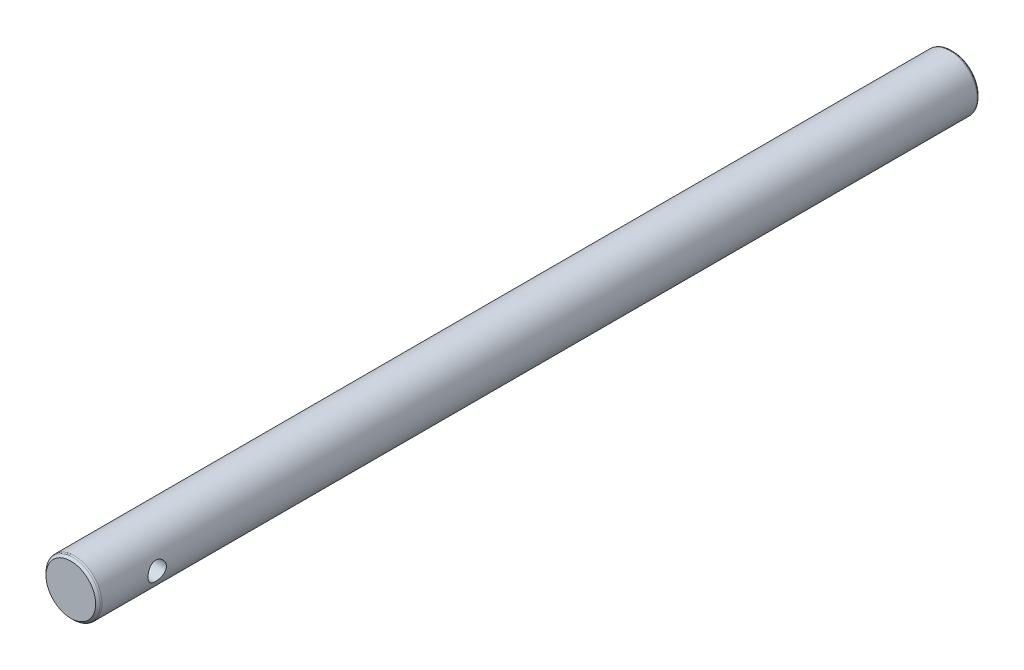
ISO-10303-21;
HEADER;
FILE_DESCRIPTION(('STEP AP214'),'2;1');
FILE_NAME('part.step','',(''),(''),'','','');
FILE_SCHEMA(('AUTOMOTIVE_DESIGN { 1 0 10303 214 1 1 1 1 }'));
ENDSEC;
DATA;
#1=APPLICATION_CONTEXT('core data for automotive mechanical design processes');
#2=APPLICATION_PROTOCOL_DEFINITION('international standard','automotive_design',2000,#1);
#3=PRODUCT_CONTEXT('',#1,'mechanical');
#4=PRODUCT('Part','Part','',(#3));
#5=PRODUCT_RELATED_PRODUCT_CATEGORY('part','',(#4));
#6=PRODUCT_DEFINITION_FORMATION('','',#4);
#7=PRODUCT_DEFINITION_CONTEXT('part definition',#1,'design');
#8=PRODUCT_DEFINITION('design','',#6,#7);
#9=PRODUCT_DEFINITION_SHAPE('','',#8);
#10=(LENGTH_UNIT() NAMED_UNIT(*) SI_UNIT(.MILLI.,.METRE.));
#11=(NAMED_UNIT(*) PLANE_ANGLE_UNIT() SI_UNIT($,.RADIAN.));
#12=(NAMED_UNIT(*) SI_UNIT($,.STERADIAN.) SOLID_ANGLE_UNIT());
#13=UNCERTAINTY_MEASURE_WITH_UNIT(LENGTH_MEASURE(1.E-05),#10,'distance_accuracy_value','');
#14=(GEOMETRIC_REPRESENTATION_CONTEXT(3) GLOBAL_UNCERTAINTY_ASSIGNED_CONTEXT((#13)) GLOBAL_UNIT_ASSIGNED_CONTEXT((#10,
#11,#12)) REPRESENTATION_CONTEXT('',''));
#15=CARTESIAN_POINT('',(0.,0.,0.));
#16=DIRECTION('',(0.,0.,1.));
#17=DIRECTION('',(1.,0.,0.));
#18=AXIS2_PLACEMENT_3D('',#15,#16,#17);
#19=CARTESIAN_POINT('',(0.,0.,76.2));
#20=DIRECTION('',(0.,0.,-1.));
#21=DIRECTION('',(-1.,0.,0.));
#22=AXIS2_PLACEMENT_3D('',#19,#20,#21);
#23=CYLINDRICAL_SURFACE('',#22,4.7625);
#24=CARTESIAN_POINT('',(4.7625,0.,67.6275));
#25=CARTESIAN_POINT('',(4.76250024290249,0.0866193385826752,67.627500402799));
#26=CARTESIAN_POINT('',(4.76011509093227,0.173236246329952,67.6203875775231));
#27=CARTESIAN_POINT('',(4.75083521197708,0.343918795385851,67.5922112897527));
#28=CARTESIAN_POINT('',(4.74394001683417,0.427984170888632,67.5711463789811));
#29=CARTESIAN_POINT('',(4.72638926301477,0.591078303334081,67.5158682011279));
#30=CARTESIAN_POINT('',(4.71573999272729,0.670115223594092,67.4816769133459));
#31=CARTESIAN_POINT('',(4.6917680757628,0.821332712178469,67.4012158881192));
#32=CARTESIAN_POINT('',(4.67844490185097,0.893511924171965,67.3549437680584));
#33=CARTESIAN_POINT('',(4.6500112492827,1.03146490909787,67.2499515347867));
#34=CARTESIAN_POINT('',(4.63485795886258,1.09696837422359,67.1908879156115));
#35=CARTESIAN_POINT('',(4.60470749718205,1.21734689966459,67.0627196419033));
#36=CARTESIAN_POINT('',(4.58971036098746,1.27221961946455,66.993612782051));
#37=CARTESIAN_POINT('',(4.56109915307671,1.37132209578676,66.8448861296256));
#38=CARTESIAN_POINT('',(4.54753724850154,1.41520046242592,66.7650211881753));
#39=CARTESIAN_POINT('',(4.52398297352028,1.48878746228092,66.5985204500471));
#40=CARTESIAN_POINT('',(4.51398951405182,1.51850041960152,66.5118867290042));
#41=CARTESIAN_POINT('',(4.49915443940135,1.56189912014583,66.337381260874));
#42=CARTESIAN_POINT('',(4.49415052034256,1.57609134913147,66.2496496815236));
#43=CARTESIAN_POINT('',(4.48938104899342,1.58962903329352,66.0729187902775));
#44=CARTESIAN_POINT('',(4.48961387798582,1.58897907629753,65.9839198786241));
#45=CARTESIAN_POINT('',(4.49514936325485,1.57324409712922,65.8115005991701));
#46=CARTESIAN_POINT('',(4.50021985189707,1.55882008715264,65.728011160366));
#47=CARTESIAN_POINT('',(4.51447944137723,1.51702478352349,65.5647129463741));
#48=CARTESIAN_POINT('',(4.52366903532269,1.48965193971464,65.4849046131218));
#49=CARTESIAN_POINT('',(4.54529683920856,1.42230325467062,65.3297322600235));
#50=CARTESIAN_POINT('',(4.55778498196572,1.38213155232282,65.2544605095671));
#51=CARTESIAN_POINT('',(4.58458186738965,1.29046145625627,65.1115174331059));
#52=CARTESIAN_POINT('',(4.5988911354236,1.2389597908779,65.0438483109932));
#53=CARTESIAN_POINT('',(4.62863135053788,1.12291706563309,64.9143170879198));
#54=CARTESIAN_POINT('',(4.64408185600812,1.05783562574618,64.8529425974668));
#55=CARTESIAN_POINT('',(4.6737101468942,0.918114067327511,64.7418516141718));
#56=CARTESIAN_POINT('',(4.68788781016681,0.843473033111574,64.6921362394138));
#57=CARTESIAN_POINT('',(4.71355908851247,0.685716835710973,64.6053821233768));
#58=CARTESIAN_POINT('',(4.72502468137762,0.602524951310954,64.5684740324966));
#59=CARTESIAN_POINT('',(4.7437765034179,0.43063966984117,64.5093274613453));
#60=CARTESIAN_POINT('',(4.75106418427121,0.341948195571001,64.4870838852652));
#61=CARTESIAN_POINT('',(4.76039857975912,0.165709329377779,64.4587616301894));
#62=CARTESIAN_POINT('',(4.76265877911043,0.0782789897854502,64.4520240529382));
#63=CARTESIAN_POINT('',(4.76232383028038,-0.0964804235618728,64.4530281193375));
#64=CARTESIAN_POINT('',(4.75972950165738,-0.183809511919942,64.460767318968));
#65=CARTESIAN_POINT('',(4.75011789238403,-0.353250287758005,64.4899839035308));
#66=CARTESIAN_POINT('',(4.74323090454018,-0.435439830850314,64.5110568521035));
#67=CARTESIAN_POINT('',(4.72585806842736,-0.595083834245077,64.5658370930909));
#68=CARTESIAN_POINT('',(4.71537176124096,-0.67253768925742,64.5995459966551));
#69=CARTESIAN_POINT('',(4.69152178418572,-0.822782670524332,64.6796243105472));
#70=CARTESIAN_POINT('',(4.6780896842481,-0.895397560257234,64.726303416837));
#71=CARTESIAN_POINT('',(4.64987090592066,-1.03197791784026,64.8306332131463));
#72=CARTESIAN_POINT('',(4.63508381455201,-1.09594073387549,64.8882872539504));
#73=CARTESIAN_POINT('',(4.60496996168956,-1.21642585614252,65.0160287672229));
#74=CARTESIAN_POINT('',(4.58964920726291,-1.27247803867768,65.0865621477463));
#75=CARTESIAN_POINT('',(4.56088707605349,-1.3720088166887,65.2363623638997));
#76=CARTESIAN_POINT('',(4.54744571493928,-1.41548730734051,65.3156292723316));
#77=CARTESIAN_POINT('',(4.5240954696882,-1.48843512703601,65.4806809117727));
#78=CARTESIAN_POINT('',(4.51417945258853,-1.517932784812,65.5664520506804));
#79=CARTESIAN_POINT('',(4.49914696286487,-1.56193278348051,65.742151106945));
#80=CARTESIAN_POINT('',(4.49402832815026,-1.57644187973942,65.8320771325794));
#81=CARTESIAN_POINT('',(4.48941600962755,-1.58952609843282,66.0085628899649));
#82=CARTESIAN_POINT('',(4.48964685408645,-1.58888153347712,66.0950582152053));
#83=CARTESIAN_POINT('',(4.49502640845388,-1.57359714084984,66.2666395564388));
#84=CARTESIAN_POINT('',(4.5001748256636,-1.55895814614054,66.3517256560037));
#85=CARTESIAN_POINT('',(4.51460432334014,-1.51665275334288,66.5164653650164));
#86=CARTESIAN_POINT('',(4.52380505610682,-1.48923906179967,66.5961914596946));
#87=CARTESIAN_POINT('',(4.54527283124317,-1.42236724314364,66.7499735085145));
#88=CARTESIAN_POINT('',(4.55754055411885,-1.38290644257921,66.8240281995109));
#89=CARTESIAN_POINT('',(4.58442741396347,-1.29105134947624,66.9678678260026));
#90=CARTESIAN_POINT('',(4.59912579731891,-1.23816783538881,67.0373254467637));
#91=CARTESIAN_POINT('',(4.62888578099663,-1.12179557697788,67.1666325787474));
#92=CARTESIAN_POINT('',(4.6439474829839,-1.05830383406677,67.2264793639048));
#93=CARTESIAN_POINT('',(4.67344173459301,-0.919545971611627,67.3372167545091));
#94=CARTESIAN_POINT('',(4.68782688609494,-0.843917402680852,67.3876674020547));
#95=CARTESIAN_POINT('',(4.71370010986521,-0.684779804883044,67.4750848058004));
#96=CARTESIAN_POINT('',(4.72518892253838,-0.601272797535128,67.5120550091513));
#97=CARTESIAN_POINT('',(4.7435375517131,-0.432583664931567,67.5699080915758));
#98=CARTESIAN_POINT('',(4.75058124720755,-0.347643065311313,67.5914359151931));
#99=CARTESIAN_POINT('',(4.76006171214452,-0.175133660416274,67.620229695575));
#100=CARTESIAN_POINT('',(4.76249975444399,-0.0875655880903884,67.6274995928008));
#101=CARTESIAN_POINT('',(4.7625,0.,67.6275));
#102=B_SPLINE_CURVE_WITH_KNOTS('',3,(#24,#25,#26,#27,#28,#29,#30,#31,#32,#33,#34,#35,#36,#37,
#38,#39,#40,#41,#42,#43,#44,#45,#46,#47,#48,#49,#50,#51,#52,#53,#54,#55,#56,#57,#58,#59,#60,#61,
#62,#63,#64,#65,#66,#67,#68,#69,#70,#71,#72,#73,#74,#75,#76,#77,#78,#79,#80,#81,#82,#83,#84,#85,
#86,#87,#88,#89,#90,#91,#92,#93,#94,#95,#96,#97,#98,#99,#100,#101),.UNSPECIFIED.,.T.,.F.,(4,2,2,
2,2,2,2,2,2,2,2,2,2,2,2,2,2,2,2,2,2,2,2,2,2,2,2,2,2,2,2,2,2,2,2,2,2,2,4),(0.,0.259535780816299,
0.519098506612198,0.77822849318157,1.03740962475609,1.30468186298879,1.57201287843958,
1.84703060907263,2.12196433449878,2.38763057115177,2.65321468955139,2.90666212150164,
3.16013990233084,3.41769971708777,3.67533400311161,3.94641872975553,4.21752944222016,
4.49132968969953,4.7650347434258,5.02687563290594,5.28867232148143,5.54288575790426,
5.79713161888529,6.05806509751946,6.31907837054766,6.59195123823207,6.86482638073074,
7.13714621950015,7.40934326970539,7.66755619877028,7.92575375970327,8.1790474449018,
8.43239738104383,8.6968023087326,8.9612821015902,9.23606961575744,9.51078681329547,
9.77323036418453,10.0356013733557),.UNSPECIFIED.);
#103=CARTESIAN_POINT('',(4.7625,0.,67.6275));
#104=VERTEX_POINT('',#103);
#105=EDGE_CURVE('E10',#104,#104,#102,.T.);
#106=ORIENTED_EDGE('',*,*,#105,.T.);
#107=EDGE_LOOP('',(#106));
#108=FACE_BOUND('',#107,.T.);
#109=CARTESIAN_POINT('',(-4.7625,0.,67.6275));
#110=CARTESIAN_POINT('',(-4.76250024290249,-0.0866193385826751,67.627500402799));
#111=CARTESIAN_POINT('',(-4.76011509093227,-0.173236246329952,67.6203875775231));
#112=CARTESIAN_POINT('',(-4.75083521197708,-0.343918795385851,67.5922112897527));
#113=CARTESIAN_POINT('',(-4.74394001683417,-0.427984170888632,67.5711463789811));
#114=CARTESIAN_POINT('',(-4.72638926301477,-0.591078303334081,67.5158682011279));
#115=CARTESIAN_POINT('',(-4.71573999272729,-0.670115223594092,67.4816769133459));
#116=CARTESIAN_POINT('',(-4.6917680757628,-0.821332712178469,67.4012158881192));
#117=CARTESIAN_POINT('',(-4.67844490185097,-0.893511924171965,67.3549437680584));
#118=CARTESIAN_POINT('',(-4.6500112492827,-1.03146490909787,67.2499515347867));
#119=CARTESIAN_POINT('',(-4.63485795886258,-1.09696837422359,67.1908879156115));
#120=CARTESIAN_POINT('',(-4.60470749718205,-1.21734689966459,67.0627196419033));
#121=CARTESIAN_POINT('',(-4.58971036098746,-1.27221961946455,66.993612782051));
#122=CARTESIAN_POINT('',(-4.56109915307671,-1.37132209578676,66.8448861296256));
#123=CARTESIAN_POINT('',(-4.54753724850154,-1.41520046242592,66.7650211881753));
#124=CARTESIAN_POINT('',(-4.52398297352028,-1.48878746228092,66.5985204500471));
#125=CARTESIAN_POINT('',(-4.51398951405182,-1.51850041960152,66.5118867290042));
#126=CARTESIAN_POINT('',(-4.49915443940135,-1.56189912014583,66.337381260874));
#127=CARTESIAN_POINT('',(-4.49415052034256,-1.57609134913147,66.2496496815236));
#128=CARTESIAN_POINT('',(-4.48938104899342,-1.58962903329352,66.0729187902775));
#129=CARTESIAN_POINT('',(-4.48961387798582,-1.58897907629753,65.9839198786241));
#130=CARTESIAN_POINT('',(-4.49514936325485,-1.57324409712922,65.8115005991701));
#131=CARTESIAN_POINT('',(-4.50021985189707,-1.55882008715264,65.728011160366));
#132=CARTESIAN_POINT('',(-4.51447944137723,-1.51702478352349,65.5647129463741));
#133=CARTESIAN_POINT('',(-4.52366903532269,-1.48965193971464,65.4849046131218));
#134=CARTESIAN_POINT('',(-4.54529683920856,-1.42230325467062,65.3297322600235));
#135=CARTESIAN_POINT('',(-4.55778498196572,-1.38213155232282,65.2544605095671));
#136=CARTESIAN_POINT('',(-4.58458186738965,-1.29046145625627,65.1115174331059));
#137=CARTESIAN_POINT('',(-4.5988911354236,-1.2389597908779,65.0438483109932));
#138=CARTESIAN_POINT('',(-4.62863135053788,-1.12291706563309,64.9143170879198));
#139=CARTESIAN_POINT('',(-4.64408185600812,-1.05783562574618,64.8529425974668));
#140=CARTESIAN_POINT('',(-4.6737101468942,-0.918114067327511,64.7418516141718));
#141=CARTESIAN_POINT('',(-4.68788781016681,-0.843473033111574,64.6921362394138));
#142=CARTESIAN_POINT('',(-4.71355908851247,-0.685716835710973,64.6053821233768));
#143=CARTESIAN_POINT('',(-4.72502468137762,-0.602524951310954,64.5684740324966));
#144=CARTESIAN_POINT('',(-4.7437765034179,-0.43063966984117,64.5093274613453));
#145=CARTESIAN_POINT('',(-4.75106418427121,-0.341948195571001,64.4870838852652));
#146=CARTESIAN_POINT('',(-4.76039857975912,-0.165709329377779,64.4587616301894));
#147=CARTESIAN_POINT('',(-4.76265877911043,-0.0782789897854506,64.4520240529382));
#148=CARTESIAN_POINT('',(-4.76232383028038,0.0964804235618722,64.4530281193375));
#149=CARTESIAN_POINT('',(-4.75972950165738,0.183809511919941,64.460767318968));
#150=CARTESIAN_POINT('',(-4.75011789238403,0.353250287758004,64.4899839035308));
#151=CARTESIAN_POINT('',(-4.74323090454018,0.435439830850314,64.5110568521035));
#152=CARTESIAN_POINT('',(-4.72585806842736,0.595083834245076,64.5658370930909));
#153=CARTESIAN_POINT('',(-4.71537176124096,0.672537689257419,64.5995459966551));
#154=CARTESIAN_POINT('',(-4.69152178418572,0.822782670524332,64.6796243105472));
#155=CARTESIAN_POINT('',(-4.6780896842481,0.895397560257234,64.726303416837));
#156=CARTESIAN_POINT('',(-4.64987090592066,1.03197791784026,64.8306332131463));
#157=CARTESIAN_POINT('',(-4.63508381455201,1.09594073387549,64.8882872539504));
#158=CARTESIAN_POINT('',(-4.60496996168956,1.21642585614252,65.0160287672229));
#159=CARTESIAN_POINT('',(-4.58964920726291,1.27247803867768,65.0865621477463));
#160=CARTESIAN_POINT('',(-4.56088707605349,1.3720088166887,65.2363623638997));
#161=CARTESIAN_POINT('',(-4.54744571493928,1.41548730734051,65.3156292723316));
#162=CARTESIAN_POINT('',(-4.5240954696882,1.48843512703601,65.4806809117727));
#163=CARTESIAN_POINT('',(-4.51417945258853,1.517932784812,65.5664520506804));
#164=CARTESIAN_POINT('',(-4.49914696286487,1.56193278348051,65.742151106945));
#165=CARTESIAN_POINT('',(-4.49402832815026,1.57644187973942,65.8320771325794));
#166=CARTESIAN_POINT('',(-4.48941600962755,1.58952609843282,66.0085628899649));
#167=CARTESIAN_POINT('',(-4.48964685408645,1.58888153347712,66.0950582152053));
#168=CARTESIAN_POINT('',(-4.49502640845388,1.57359714084984,66.2666395564388));
#169=CARTESIAN_POINT('',(-4.5001748256636,1.55895814614054,66.3517256560037));
#170=CARTESIAN_POINT('',(-4.51460432334014,1.51665275334288,66.5164653650164));
#171=CARTESIAN_POINT('',(-4.52380505610682,1.48923906179967,66.5961914596946));
#172=CARTESIAN_POINT('',(-4.54527283124317,1.42236724314364,66.7499735085145));
#173=CARTESIAN_POINT('',(-4.55754055411885,1.38290644257921,66.8240281995109));
#174=CARTESIAN_POINT('',(-4.58442741396347,1.29105134947624,66.9678678260026));
#175=CARTESIAN_POINT('',(-4.59912579731891,1.23816783538881,67.0373254467637));
#176=CARTESIAN_POINT('',(-4.62888578099663,1.12179557697788,67.1666325787474));
#177=CARTESIAN_POINT('',(-4.6439474829839,1.05830383406677,67.2264793639048));
#178=CARTESIAN_POINT('',(-4.67344173459301,0.919545971611627,67.3372167545091));
#179=CARTESIAN_POINT('',(-4.68782688609494,0.843917402680852,67.3876674020547));
#180=CARTESIAN_POINT('',(-4.71370010986521,0.684779804883044,67.4750848058004));
#181=CARTESIAN_POINT('',(-4.72518892253838,0.601272797535128,67.5120550091513));
#182=CARTESIAN_POINT('',(-4.7435375517131,0.432583664931567,67.5699080915758));
#183=CARTESIAN_POINT('',(-4.75058124720755,0.347643065311313,67.5914359151931));
#184=CARTESIAN_POINT('',(-4.76006171214452,0.175133660416274,67.620229695575));
#185=CARTESIAN_POINT('',(-4.76249975444399,0.0875655880903884,67.6274995928008));
#186=CARTESIAN_POINT('',(-4.7625,0.,67.6275));
#187=B_SPLINE_CURVE_WITH_KNOTS('',3,(#109,#110,#111,#112,#113,#114,#115,#116,#117,#118,#119,
#120,#121,#122,#123,#124,#125,#126,#127,#128,#129,#130,#131,#132,#133,#134,#135,#136,#137,#138,
#139,#140,#141,#142,#143,#144,#145,#146,#147,#148,#149,#150,#151,#152,#153,#154,#155,#156,#157,
#158,#159,#160,#161,#162,#163,#164,#165,#166,#167,#168,#169,#170,#171,#172,#173,#174,#175,#176,
#177,#178,#179,#180,#181,#182,#183,#184,#185,#186),.UNSPECIFIED.,.T.,.F.,(4,2,2,2,2,2,2,2,2,2,2,
2,2,2,2,2,2,2,2,2,2,2,2,2,2,2,2,2,2,2,2,2,2,2,2,2,2,2,4),(0.,0.259535780816298,
0.519098506612198,0.778228493181571,1.03740962475609,1.30468186298879,1.57201287843958,
1.84703060907263,2.12196433449878,2.38763057115177,2.65321468955139,2.90666212150164,
3.16013990233084,3.41769971708777,3.67533400311161,3.94641872975553,4.21752944222016,
4.49132968969953,4.7650347434258,5.02687563290594,5.28867232148142,5.54288575790426,
5.79713161888528,6.05806509751945,6.31907837054766,6.59195123823207,6.86482638073074,
7.13714621950015,7.40934326970539,7.66755619877028,7.92575375970327,8.1790474449018,
8.43239738104383,8.69680230873259,8.9612821015902,9.23606961575743,9.51078681329547,
9.77323036418453,10.0356013733557),.UNSPECIFIED.);
#188=CARTESIAN_POINT('',(-4.7625,0.,67.6275));
#189=VERTEX_POINT('',#188);
#190=EDGE_CURVE('E43',#189,#189,#187,.T.);
#191=ORIENTED_EDGE('',*,*,#190,.T.);
#192=EDGE_LOOP('',(#191));
#193=FACE_BOUND('',#192,.T.);
#194=CARTESIAN_POINT('',(0.,0.,75.5757980931899));
#195=DIRECTION('',(0.,0.,1.));
#196=DIRECTION('',(1.,0.,0.));
#197=AXIS2_PLACEMENT_3D('',#194,#195,#196);
#198=CIRCLE('',#197,4.7625);
#199=CARTESIAN_POINT('',(4.7625,0.,75.5757980931899));
#200=VERTEX_POINT('',#199);
#201=EDGE_CURVE('E86',#200,#200,#198,.F.);
#202=ORIENTED_EDGE('',*,*,#201,.T.);
#203=EDGE_LOOP('',(#202));
#204=FACE_BOUND('',#203,.T.);
#205=CARTESIAN_POINT('',(0.,0.,-75.5757980931897));
#206=DIRECTION('',(0.,0.,-1.));
#207=DIRECTION('',(-1.,0.,0.));
#208=AXIS2_PLACEMENT_3D('',#205,#206,#207);
#209=CIRCLE('',#208,4.7625);
#210=CARTESIAN_POINT('',(-4.7625,0.,-75.5757980931897));
#211=VERTEX_POINT('',#210);
#212=EDGE_CURVE('E89',#211,#211,#209,.F.);
#213=ORIENTED_EDGE('',*,*,#212,.T.);
#214=EDGE_LOOP('',(#213));
#215=FACE_BOUND('',#214,.T.);
#216=ADVANCED_FACE('F31',(#108,#193,#204,#215),#23,.T.);
#217=CARTESIAN_POINT('',(0.,0.,76.2));
#218=DIRECTION('',(0.,0.,1.));
#219=DIRECTION('',(1.,0.,0.));
#220=AXIS2_PLACEMENT_3D('',#217,#218,#219);
#221=PLANE('',#220);
#222=CARTESIAN_POINT('',(0.,0.,76.2));
#223=DIRECTION('',(0.,0.,1.));
#224=DIRECTION('',(1.,0.,0.));
#225=AXIS2_PLACEMENT_3D('',#222,#223,#224);
#226=CIRCLE('',#225,4.28625000000007);
#227=CARTESIAN_POINT('',(-4.28625000000008,0.,76.2));
#228=VERTEX_POINT('',#227);
#229=EDGE_CURVE('E94',#228,#228,#226,.T.);
#230=ORIENTED_EDGE('',*,*,#229,.T.);
#231=EDGE_LOOP('',(#230));
#232=FACE_BOUND('',#231,.T.);
#233=ADVANCED_FACE('F65',(#232),#221,.T.);
#234=CARTESIAN_POINT('',(0.,0.,-76.2));
#235=DIRECTION('',(0.,0.,1.));
#236=DIRECTION('',(1.,0.,0.));
#237=AXIS2_PLACEMENT_3D('',#234,#235,#236);
#238=PLANE('',#237);
#239=CARTESIAN_POINT('',(0.,0.,-76.2));
#240=DIRECTION('',(0.,0.,1.));
#241=DIRECTION('',(1.,0.,0.));
#242=AXIS2_PLACEMENT_3D('',#239,#240,#241);
#243=CIRCLE('',#242,4.28624999999988);
#244=CARTESIAN_POINT('',(4.28624999999988,0.,-76.2));
#245=VERTEX_POINT('',#244);
#246=EDGE_CURVE('E91',#245,#245,#243,.F.);
#247=ORIENTED_EDGE('',*,*,#246,.T.);
#248=EDGE_LOOP('',(#247));
#249=FACE_BOUND('',#248,.T.);
#250=ADVANCED_FACE('F68',(#249),#238,.F.);
#251=CARTESIAN_POINT('',(0.,0.,76.2));
#252=DIRECTION('',(0.,0.,-1.));
#253=DIRECTION('',(-1.,0.,0.));
#254=AXIS2_PLACEMENT_3D('',#251,#252,#253);
#255=CONICAL_SURFACE('',#254,4.28625000000007,0.78539816339746);
#256=CARTESIAN_POINT('',(0.,0.,75.828367796595));
#257=DIRECTION('',(0.,0.,-1.));
#258=DIRECTION('',(-1.,0.,0.));
#259=AXIS2_PLACEMENT_3D('',#256,#257,#258);
#260=CIRCLE('',#259,4.65788220340507);
#261=CARTESIAN_POINT('',(-4.65788220340506,0.,75.828367796595));
#262=VERTEX_POINT('',#261);
#263=EDGE_CURVE('E51',#262,#262,#260,.F.);
#264=CARTESIAN_POINT('',(-4.65788220340506,0.,75.828367796595));
#265=CARTESIAN_POINT('',(-4.65401103461959,0.,75.8322389653805));
#266=CARTESIAN_POINT('',(-4.65013986583412,0.,75.836110134166));
#267=CARTESIAN_POINT('',(-4.64239752826319,0.,75.8438524717369));
#268=CARTESIAN_POINT('',(-4.63852635947772,0.,75.8477236405224));
#269=CARTESIAN_POINT('',(-4.63078402190678,0.,75.8554659780933));
#270=CARTESIAN_POINT('',(-4.62691285312131,0.,75.8593371468788));
#271=CARTESIAN_POINT('',(-4.61917051555037,0.,75.8670794844497));
#272=CARTESIAN_POINT('',(-4.61529934676491,0.,75.8709506532352));
#273=CARTESIAN_POINT('',(-4.60755700919397,0.,75.8786929908061));
#274=CARTESIAN_POINT('',(-4.6036858404085,0.,75.8825641595916));
#275=CARTESIAN_POINT('',(-4.59594350283756,0.,75.8903064971625));
#276=CARTESIAN_POINT('',(-4.59207233405209,0.,75.894177665948));
#277=CARTESIAN_POINT('',(-4.58432999648116,0.,75.9019200035189));
#278=CARTESIAN_POINT('',(-4.58045882769569,0.,75.9057911723044));
#279=CARTESIAN_POINT('',(-4.57271649012475,0.,75.9135335098753));
#280=CARTESIAN_POINT('',(-4.56884532133929,0.,75.9174046786608));
#281=CARTESIAN_POINT('',(-4.56110298376835,0.,75.9251470162317));
#282=CARTESIAN_POINT('',(-4.55723181498288,0.,75.9290181850172));
#283=CARTESIAN_POINT('',(-4.54948947741194,0.,75.9367605225881));
#284=CARTESIAN_POINT('',(-4.54561830862647,0.,75.9406316913736));
#285=CARTESIAN_POINT('',(-4.53787597105554,0.,75.9483740289446));
#286=CARTESIAN_POINT('',(-4.53400480227007,0.,75.95224519773));
#287=CARTESIAN_POINT('',(-4.52626246469913,0.,75.959987535301));
#288=CARTESIAN_POINT('',(-4.52239129591366,0.,75.9638587040864));
#289=CARTESIAN_POINT('',(-4.51464895834273,0.,75.9716010416574));
#290=CARTESIAN_POINT('',(-4.51077778955725,0.,75.9754722104428));
#291=CARTESIAN_POINT('',(-4.50303545198632,0.,75.9832145480138));
#292=CARTESIAN_POINT('',(-4.49916428320085,0.,75.9870857167992));
#293=CARTESIAN_POINT('',(-4.49142194562991,0.,75.9948280543702));
#294=CARTESIAN_POINT('',(-4.48755077684444,0.,75.9986992231556));
#295=CARTESIAN_POINT('',(-4.47980843927351,0.,76.0064415607266));
#296=CARTESIAN_POINT('',(-4.47593727048804,0.,76.0103127295121));
#297=CARTESIAN_POINT('',(-4.4681949329171,0.,76.018055067083));
#298=CARTESIAN_POINT('',(-4.46432376413163,0.,76.0219262358684));
#299=CARTESIAN_POINT('',(-4.4565814265607,0.,76.0296685734394));
#300=CARTESIAN_POINT('',(-4.45271025777523,0.,76.0335397422248));
#301=CARTESIAN_POINT('',(-4.44496792020429,0.,76.0412820797958));
#302=CARTESIAN_POINT('',(-4.44109675141882,0.,76.0451532485813));
#303=CARTESIAN_POINT('',(-4.43335441384789,0.,76.0528955861522));
#304=CARTESIAN_POINT('',(-4.42948324506242,0.,76.0567667549377));
#305=CARTESIAN_POINT('',(-4.42174090749148,0.,76.0645090925086));
#306=CARTESIAN_POINT('',(-4.41786973870601,0.,76.0683802612941));
#307=CARTESIAN_POINT('',(-4.41012740113507,0.,76.076122598865));
#308=CARTESIAN_POINT('',(-4.4062562323496,0.,76.0799937676505));
#309=CARTESIAN_POINT('',(-4.39851389477867,0.,76.0877361052214));
#310=CARTESIAN_POINT('',(-4.3946427259932,0.,76.0916072740069));
#311=CARTESIAN_POINT('',(-4.38690038842226,0.,76.0993496115778));
#312=CARTESIAN_POINT('',(-4.3830292196368,0.,76.1032207803633));
#313=CARTESIAN_POINT('',(-4.37528688206586,0.,76.1109631179342));
#314=CARTESIAN_POINT('',(-4.37141571328039,0.,76.1148342867197));
#315=CARTESIAN_POINT('',(-4.36367337570945,0.,76.1225766242906));
#316=CARTESIAN_POINT('',(-4.35980220692398,0.,76.1264477930761));
#317=CARTESIAN_POINT('',(-4.35205986935305,0.,76.134190130647));
#318=CARTESIAN_POINT('',(-4.34818870056758,0.,76.1380612994325));
#319=CARTESIAN_POINT('',(-4.34044636299664,0.,76.1458036370035));
#320=CARTESIAN_POINT('',(-4.33657519421117,0.,76.1496748057889));
#321=CARTESIAN_POINT('',(-4.32883285664024,0.,76.1574171433598));
#322=CARTESIAN_POINT('',(-4.32496168785477,0.,76.1612883121453));
#323=CARTESIAN_POINT('',(-4.31721935028383,0.,76.1690306497162));
#324=CARTESIAN_POINT('',(-4.31334818149836,0.,76.1729018185017));
#325=CARTESIAN_POINT('',(-4.30560584392742,0.,76.1806441560727));
#326=CARTESIAN_POINT('',(-4.30173467514196,0.,76.1845153248581));
#327=CARTESIAN_POINT('',(-4.29399233757102,0.,76.1922576624291));
#328=CARTESIAN_POINT('',(-4.29012116878555,0.,76.1961288312145));
#329=CARTESIAN_POINT('',(-4.28625000000008,0.,76.2));
#330=B_SPLINE_CURVE_WITH_KNOTS('',3,(#264,#265,#266,#267,#268,#269,#270,#271,#272,#273,#274,
#275,#276,#277,#278,#279,#280,#281,#282,#283,#284,#285,#286,#287,#288,#289,#290,#291,#292,#293,
#294,#295,#296,#297,#298,#299,#300,#301,#302,#303,#304,#305,#306,#307,#308,#309,#310,#311,#312,
#313,#314,#315,#316,#317,#318,#319,#320,#321,#322,#323,#324,#325,#326,#327,#328,#329),
.UNSPECIFIED.,.F.,.F.,(4,2,2,2,2,2,2,2,2,2,2,2,2,2,2,2,2,2,2,2,2,2,2,2,2,2,2,2,2,2,2,2,4),(0.,
0.0164239781959272,0.0328479563918648,0.0492719345878018,0.0656959127837388,0.082119890979666,
0.0985438691756036,0.114967847371541,0.131391825567478,0.147815803763405,0.164239781959342,
0.180663760155279,0.197087738351217,0.213511716547144,0.229935694743081,0.246359672939019,
0.262783651134956,0.279207629330883,0.295631607526821,0.312055585722758,0.328479563918695,
0.344903542114622,0.361327520310559,0.377751498506497,0.394175476702434,0.410599454898361,
0.427023433094298,0.443447411290235,0.459871389486173,0.4762953676821,0.492719345878037,
0.509143324073975,0.525567302269912),.UNSPECIFIED.);
#331=EDGE_CURVE('BSEAM71',#262,#228,#330,.T.);
#332=ORIENTED_EDGE('',*,*,#263,.T.);
#333=ORIENTED_EDGE('',*,*,#229,.F.);
#334=ORIENTED_EDGE('',*,*,#331,.T.);
#335=ORIENTED_EDGE('',*,*,#331,.F.);
#336=EDGE_LOOP('',(#332,#334,#333,#335));
#337=FACE_BOUND('',#336,.T.);
#338=ADVANCED_FACE('F71',(#337),#255,.T.);
#339=CARTESIAN_POINT('',(0.,0.,-75.7237499999999));
#340=DIRECTION('',(0.,0.,1.));
#341=DIRECTION('',(1.,0.,0.));
#342=AXIS2_PLACEMENT_3D('',#339,#340,#341);
#343=CONICAL_SURFACE('',#342,4.7625,0.785398163397446);
#344=CARTESIAN_POINT('',(0.,0.,-75.8283677965948));
#345=DIRECTION('',(0.,0.,1.));
#346=DIRECTION('',(1.,0.,0.));
#347=AXIS2_PLACEMENT_3D('',#344,#345,#346);
#348=CIRCLE('',#347,4.65788220340507);
#349=CARTESIAN_POINT('',(4.65788220340507,0.,-75.8283677965948));
#350=VERTEX_POINT('',#349);
#351=EDGE_CURVE('E47',#350,#350,#348,.F.);
#352=ORIENTED_EDGE('',*,*,#351,.T.);
#353=EDGE_LOOP('',(#352));
#354=FACE_BOUND('',#353,.T.);
#355=ORIENTED_EDGE('',*,*,#246,.F.);
#356=EDGE_LOOP('',(#355));
#357=FACE_BOUND('',#356,.T.);
#358=ADVANCED_FACE('F76',(#354,#357),#343,.T.);
#359=CARTESIAN_POINT('',(0.,0.,75.5757980931899));
#360=DIRECTION('',(0.,0.,1.));
#361=DIRECTION('',(1.,0.,0.));
#362=AXIS2_PLACEMENT_3D('',#359,#360,#361);
#363=TOROIDAL_SURFACE('',#362,4.4053125,0.3571875);
#364=ORIENTED_EDGE('',*,*,#263,.F.);
#365=EDGE_LOOP('',(#364));
#366=FACE_BOUND('',#365,.T.);
#367=ORIENTED_EDGE('',*,*,#201,.F.);
#368=EDGE_LOOP('',(#367));
#369=FACE_BOUND('',#368,.T.);
#370=ADVANCED_FACE('F101',(#366,#369),#363,.T.);
#371=CARTESIAN_POINT('',(0.,0.,-75.5757980931897));
#372=DIRECTION('',(0.,0.,-1.));
#373=DIRECTION('',(-1.,0.,0.));
#374=AXIS2_PLACEMENT_3D('',#371,#372,#373);
#375=TOROIDAL_SURFACE('',#374,4.4053125,0.3571875);
#376=ORIENTED_EDGE('',*,*,#351,.F.);
#377=EDGE_LOOP('',(#376));
#378=FACE_BOUND('',#377,.T.);
#379=ORIENTED_EDGE('',*,*,#212,.F.);
#380=EDGE_LOOP('',(#379));
#381=FACE_BOUND('',#380,.T.);
#382=ADVANCED_FACE('F33',(#378,#381),#375,.T.);
#383=CARTESIAN_POINT('',(4.7625,0.,66.04));
#384=DIRECTION('',(-1.,0.,0.));
#385=DIRECTION('',(0.,0.,1.));
#386=AXIS2_PLACEMENT_3D('',#383,#384,#385);
#387=CYLINDRICAL_SURFACE('',#386,1.58750000000004);
#388=ORIENTED_EDGE('',*,*,#190,.F.);
#389=EDGE_LOOP('',(#388));
#390=FACE_BOUND('',#389,.T.);
#391=ORIENTED_EDGE('',*,*,#105,.F.);
#392=EDGE_LOOP('',(#391));
#393=FACE_BOUND('',#392,.T.);
#394=ADVANCED_FACE('F60',(#390,#393),#387,.F.);
#395=CLOSED_SHELL('',(#216,#233,#250,#338,#358,#370,#382,#394));
#396=MANIFOLD_SOLID_BREP('B2',#395);
#397=ADVANCED_BREP_SHAPE_REPRESENTATION('',(#18,#396),#14);
#398=SHAPE_DEFINITION_REPRESENTATION(#9,#397);
ENDSEC;
END-ISO-10303-21;
